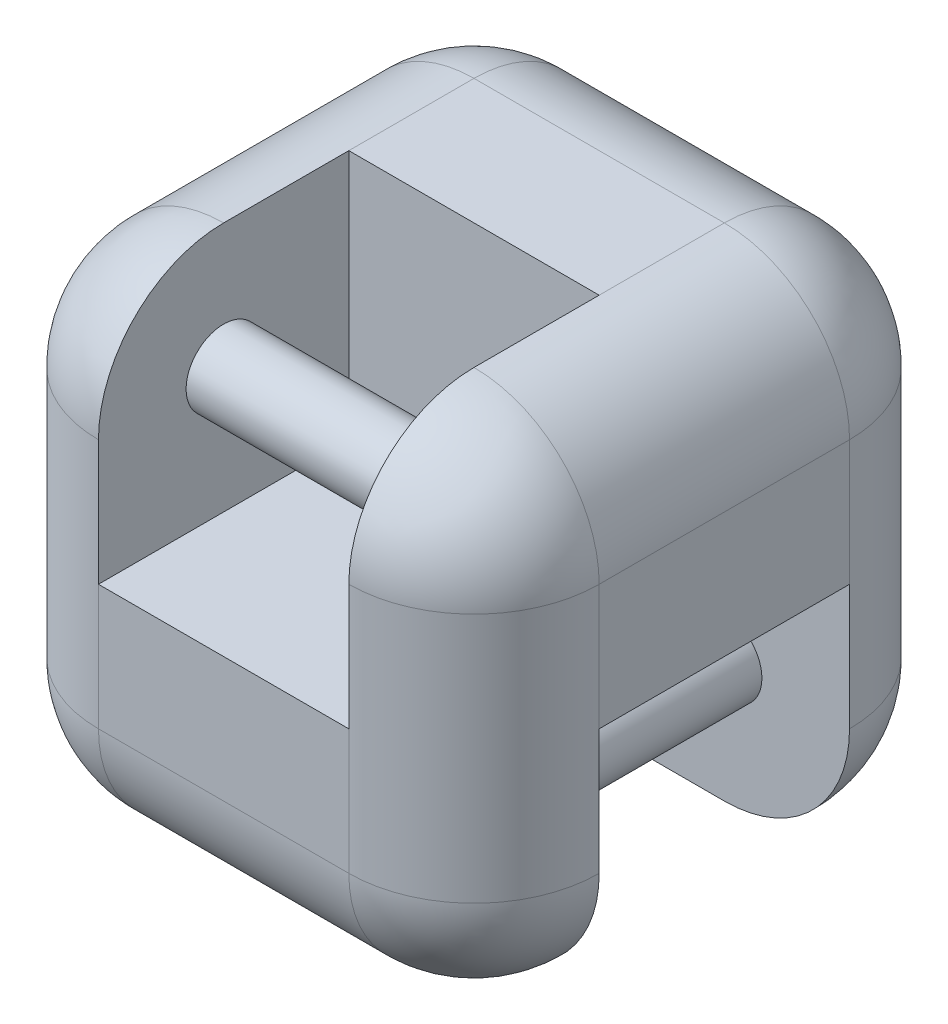
ISO-10303-21;
HEADER;
FILE_DESCRIPTION(('STEP AP214'),'2;1');
FILE_NAME('part.step','',(''),(''),'','','');
FILE_SCHEMA(('AUTOMOTIVE_DESIGN { 1 0 10303 214 1 1 1 1 }'));
ENDSEC;
DATA;
#1=APPLICATION_CONTEXT('core data for automotive mechanical design processes');
#2=APPLICATION_PROTOCOL_DEFINITION('international standard','automotive_design',2000,#1);
#3=PRODUCT_CONTEXT('',#1,'mechanical');
#4=PRODUCT('Part','Part','',(#3));
#5=PRODUCT_RELATED_PRODUCT_CATEGORY('part','',(#4));
#6=PRODUCT_DEFINITION_FORMATION('','',#4);
#7=PRODUCT_DEFINITION_CONTEXT('part definition',#1,'design');
#8=PRODUCT_DEFINITION('design','',#6,#7);
#9=PRODUCT_DEFINITION_SHAPE('','',#8);
#10=(LENGTH_UNIT() NAMED_UNIT(*) SI_UNIT(.MILLI.,.METRE.));
#11=(NAMED_UNIT(*) PLANE_ANGLE_UNIT() SI_UNIT($,.RADIAN.));
#12=(NAMED_UNIT(*) SI_UNIT($,.STERADIAN.) SOLID_ANGLE_UNIT());
#13=UNCERTAINTY_MEASURE_WITH_UNIT(LENGTH_MEASURE(1.E-05),#10,'distance_accuracy_value','');
#14=(GEOMETRIC_REPRESENTATION_CONTEXT(3) GLOBAL_UNCERTAINTY_ASSIGNED_CONTEXT((#13)) GLOBAL_UNIT_ASSIGNED_CONTEXT((#10,
#11,#12)) REPRESENTATION_CONTEXT('',''));
#15=CARTESIAN_POINT('',(0.,0.,0.));
#16=DIRECTION('',(0.,0.,1.));
#17=DIRECTION('',(1.,0.,0.));
#18=AXIS2_PLACEMENT_3D('',#15,#16,#17);
#19=CARTESIAN_POINT('',(-8.40814268768748,22.1655598813284,15.));
#20=DIRECTION('',(0.,0.,-1.));
#21=DIRECTION('',(-1.,0.,0.));
#22=AXIS2_PLACEMENT_3D('',#19,#20,#21);
#23=CYLINDRICAL_SURFACE('',#22,1.5);
#24=CARTESIAN_POINT('',(-8.40814268768748,22.1655598813284,15.));
#25=DIRECTION('',(0.,0.,1.));
#26=DIRECTION('',(1.,0.,0.));
#27=AXIS2_PLACEMENT_3D('',#24,#25,#26);
#28=CIRCLE('',#27,1.5);
#29=CARTESIAN_POINT('',(-6.90814268768748,22.1655598813284,15.));
#30=VERTEX_POINT('',#29);
#31=EDGE_CURVE('E11',#30,#30,#28,.T.);
#32=ORIENTED_EDGE('',*,*,#31,.F.);
#33=EDGE_LOOP('',(#32));
#34=FACE_BOUND('',#33,.T.);
#35=CARTESIAN_POINT('',(-8.40814268768748,22.1655598813284,5.));
#36=DIRECTION('',(0.,0.,1.));
#37=DIRECTION('',(1.,0.,0.));
#38=AXIS2_PLACEMENT_3D('',#35,#36,#37);
#39=CIRCLE('',#38,1.5);
#40=CARTESIAN_POINT('',(-6.90814268768748,22.1655598813284,5.));
#41=VERTEX_POINT('',#40);
#42=EDGE_CURVE('E46',#41,#41,#39,.T.);
#43=ORIENTED_EDGE('',*,*,#42,.T.);
#44=EDGE_LOOP('',(#43));
#45=FACE_BOUND('',#44,.T.);
#46=ADVANCED_FACE('F43',(#34,#45),#23,.T.);
#47=CARTESIAN_POINT('',(-8.40814268768748,22.1655598813284,15.));
#48=DIRECTION('',(0.,0.,1.));
#49=DIRECTION('',(1.,0.,0.));
#50=AXIS2_PLACEMENT_3D('',#47,#48,#49);
#51=PLANE('',#50);
#52=ORIENTED_EDGE('',*,*,#31,.T.);
#53=EDGE_LOOP('',(#52));
#54=FACE_BOUND('',#53,.T.);
#55=ADVANCED_FACE('F58',(#54),#51,.T.);
#56=CARTESIAN_POINT('',(-8.40814268768748,22.1655598813284,5.));
#57=DIRECTION('',(0.,0.,1.));
#58=DIRECTION('',(1.,0.,0.));
#59=AXIS2_PLACEMENT_3D('',#56,#57,#58);
#60=PLANE('',#59);
#61=ORIENTED_EDGE('',*,*,#42,.F.);
#62=EDGE_LOOP('',(#61));
#63=FACE_BOUND('',#62,.T.);
#64=ADVANCED_FACE('F56',(#63),#60,.F.);
#65=CLOSED_SHELL('',(#46,#55,#64));
#66=MANIFOLD_SOLID_BREP('B2',#65);
#67=CARTESIAN_POINT('',(-18.4081426876875,32.1655598813284,15.));
#68=DIRECTION('',(1.,0.,0.));
#69=DIRECTION('',(0.,0.,-1.));
#70=AXIS2_PLACEMENT_3D('',#67,#68,#69);
#71=CYLINDRICAL_SURFACE('',#70,1.5);
#72=CARTESIAN_POINT('',(-18.4081426876875,32.1655598813284,15.));
#73=DIRECTION('',(-1.,0.,0.));
#74=DIRECTION('',(0.,0.,1.));
#75=AXIS2_PLACEMENT_3D('',#72,#73,#74);
#76=CIRCLE('',#75,1.5);
#77=CARTESIAN_POINT('',(-18.4081426876875,32.1655598813284,16.5));
#78=VERTEX_POINT('',#77);
#79=EDGE_CURVE('E42',#78,#78,#76,.T.);
#80=ORIENTED_EDGE('',*,*,#79,.F.);
#81=EDGE_LOOP('',(#80));
#82=FACE_BOUND('',#81,.T.);
#83=CARTESIAN_POINT('',(-8.40814268768748,32.1655598813284,15.));
#84=DIRECTION('',(-1.,0.,0.));
#85=DIRECTION('',(0.,0.,1.));
#86=AXIS2_PLACEMENT_3D('',#83,#84,#85);
#87=CIRCLE('',#86,1.5);
#88=CARTESIAN_POINT('',(-8.40814268768748,32.1655598813284,16.5));
#89=VERTEX_POINT('',#88);
#90=EDGE_CURVE('E95',#89,#89,#87,.T.);
#91=ORIENTED_EDGE('',*,*,#90,.T.);
#92=EDGE_LOOP('',(#91));
#93=FACE_BOUND('',#92,.T.);
#94=ADVANCED_FACE('F92',(#82,#93),#71,.T.);
#95=CARTESIAN_POINT('',(-18.4081426876875,32.1655598813284,15.));
#96=DIRECTION('',(-1.,0.,0.));
#97=DIRECTION('',(0.,0.,1.));
#98=AXIS2_PLACEMENT_3D('',#95,#96,#97);
#99=PLANE('',#98);
#100=ORIENTED_EDGE('',*,*,#79,.T.);
#101=EDGE_LOOP('',(#100));
#102=FACE_BOUND('',#101,.T.);
#103=ADVANCED_FACE('F107',(#102),#99,.T.);
#104=CARTESIAN_POINT('',(-8.40814268768748,32.1655598813284,15.));
#105=DIRECTION('',(-1.,0.,0.));
#106=DIRECTION('',(0.,0.,1.));
#107=AXIS2_PLACEMENT_3D('',#104,#105,#106);
#108=PLANE('',#107);
#109=ORIENTED_EDGE('',*,*,#90,.F.);
#110=EDGE_LOOP('',(#109));
#111=FACE_BOUND('',#110,.T.);
#112=ADVANCED_FACE('F105',(#111),#108,.F.);
#113=CLOSED_SHELL('',(#94,#103,#112));
#114=MANIFOLD_SOLID_BREP('B6',#113);
#115=CARTESIAN_POINT('',(-23.4081426876875,17.1655598813284,20.));
#116=DIRECTION('',(0.,1.,0.));
#117=DIRECTION('',(0.,0.,1.));
#118=AXIS2_PLACEMENT_3D('',#115,#116,#117);
#119=PLANE('',#118);
#120=DIRECTION('',(0.,0.,-1.));
#121=VECTOR('',#120,1.);
#122=CARTESIAN_POINT('',(-13.4081426876875,17.1655598813284,15.));
#123=LINE('',#122,#121);
#124=CARTESIAN_POINT('',(-13.4081426876875,17.1655598813284,15.));
#125=VERTEX_POINT('',#124);
#126=CARTESIAN_POINT('',(-13.4081426876875,17.1655598813284,5.));
#127=VERTEX_POINT('',#126);
#128=EDGE_CURVE('E149',#125,#127,#123,.T.);
#129=ORIENTED_EDGE('',*,*,#128,.F.);
#130=DIRECTION('',(1.,0.,0.));
#131=VECTOR('',#130,1.);
#132=CARTESIAN_POINT('',(-23.4081426876875,17.1655598813284,15.));
#133=LINE('',#132,#131);
#134=CARTESIAN_POINT('',(-18.4081426876875,17.1655598813284,15.));
#135=VERTEX_POINT('',#134);
#136=EDGE_CURVE('E415',#125,#135,#133,.F.);
#137=ORIENTED_EDGE('',*,*,#136,.T.);
#138=DIRECTION('',(0.,0.,-1.));
#139=VECTOR('',#138,1.);
#140=CARTESIAN_POINT('',(-18.4081426876875,17.1655598813284,20.));
#141=LINE('',#140,#139);
#142=CARTESIAN_POINT('',(-18.4081426876875,17.1655598813284,5.));
#143=VERTEX_POINT('',#142);
#144=EDGE_CURVE('E300',#135,#143,#141,.T.);
#145=ORIENTED_EDGE('',*,*,#144,.T.);
#146=DIRECTION('',(1.,0.,0.));
#147=VECTOR('',#146,1.);
#148=CARTESIAN_POINT('',(-23.4081426876875,17.1655598813284,5.));
#149=LINE('',#148,#147);
#150=EDGE_CURVE('E305',#143,#127,#149,.T.);
#151=ORIENTED_EDGE('',*,*,#150,.T.);
#152=EDGE_LOOP('',(#129,#137,#145,#151));
#153=FACE_BOUND('',#152,.T.);
#154=ADVANCED_FACE('F132',(#153),#119,.F.);
#155=CARTESIAN_POINT('',(-3.40814268768748,37.1655598813284,20.));
#156=DIRECTION('',(-1.,0.,0.));
#157=DIRECTION('',(0.,0.,1.));
#158=AXIS2_PLACEMENT_3D('',#155,#156,#157);
#159=PLANE('',#158);
#160=DIRECTION('',(0.,0.,-1.));
#161=VECTOR('',#160,1.);
#162=CARTESIAN_POINT('',(-3.40814268768748,27.1655598813284,15.));
#163=LINE('',#162,#161);
#164=CARTESIAN_POINT('',(-3.40814268768748,27.1655598813284,15.));
#165=VERTEX_POINT('',#164);
#166=CARTESIAN_POINT('',(-3.40814268768748,27.1655598813284,5.));
#167=VERTEX_POINT('',#166);
#168=EDGE_CURVE('E276',#165,#167,#163,.T.);
#169=ORIENTED_EDGE('',*,*,#168,.T.);
#170=DIRECTION('',(0.,1.,0.));
#171=VECTOR('',#170,1.);
#172=CARTESIAN_POINT('',(-3.40814268768748,37.1655598813284,5.));
#173=LINE('',#172,#171);
#174=CARTESIAN_POINT('',(-3.40814268768748,32.1655598813284,5.));
#175=VERTEX_POINT('',#174);
#176=EDGE_CURVE('E302',#167,#175,#173,.T.);
#177=ORIENTED_EDGE('',*,*,#176,.T.);
#178=DIRECTION('',(0.,0.,-1.));
#179=VECTOR('',#178,1.);
#180=CARTESIAN_POINT('',(-3.40814268768748,32.1655598813284,20.));
#181=LINE('',#180,#179);
#182=CARTESIAN_POINT('',(-3.40814268768748,32.1655598813284,15.));
#183=VERTEX_POINT('',#182);
#184=EDGE_CURVE('E299',#175,#183,#181,.F.);
#185=ORIENTED_EDGE('',*,*,#184,.T.);
#186=DIRECTION('',(0.,1.,0.));
#187=VECTOR('',#186,1.);
#188=CARTESIAN_POINT('',(-3.40814268768748,17.1655598813284,15.));
#189=LINE('',#188,#187);
#190=EDGE_CURVE('E289',#183,#165,#189,.F.);
#191=ORIENTED_EDGE('',*,*,#190,.T.);
#192=EDGE_LOOP('',(#169,#177,#185,#191));
#193=FACE_BOUND('',#192,.T.);
#194=ADVANCED_FACE('F297',(#193),#159,.F.);
#195=CARTESIAN_POINT('',(-18.4081426876875,27.1655598813284,10.));
#196=DIRECTION('',(0.,1.,0.));
#197=DIRECTION('',(0.,0.,1.));
#198=AXIS2_PLACEMENT_3D('',#195,#196,#197);
#199=PLANE('',#198);
#200=DIRECTION('',(-1.,0.,0.));
#201=VECTOR('',#200,1.);
#202=CARTESIAN_POINT('',(-13.4081426876875,27.1655598813284,15.));
#203=LINE('',#202,#201);
#204=CARTESIAN_POINT('',(-8.40814268768748,27.1655598813284,15.));
#205=VERTEX_POINT('',#204);
#206=CARTESIAN_POINT('',(-13.4081426876875,27.1655598813284,15.));
#207=VERTEX_POINT('',#206);
#208=EDGE_CURVE('E270',#205,#207,#203,.T.);
#209=ORIENTED_EDGE('',*,*,#208,.T.);
#210=DIRECTION('',(0.,0.,-1.));
#211=VECTOR('',#210,1.);
#212=CARTESIAN_POINT('',(-13.4081426876875,27.1655598813284,15.));
#213=LINE('',#212,#211);
#214=CARTESIAN_POINT('',(-13.4081426876875,27.1655598813284,10.));
#215=VERTEX_POINT('',#214);
#216=EDGE_CURVE('E284',#207,#215,#213,.T.);
#217=ORIENTED_EDGE('',*,*,#216,.T.);
#218=DIRECTION('',(1.,0.,0.));
#219=VECTOR('',#218,1.);
#220=CARTESIAN_POINT('',(-18.4081426876875,27.1655598813284,10.));
#221=LINE('',#220,#219);
#222=CARTESIAN_POINT('',(-18.4081426876875,27.1655598813284,10.));
#223=VERTEX_POINT('',#222);
#224=EDGE_CURVE('E457',#223,#215,#221,.T.);
#225=ORIENTED_EDGE('',*,*,#224,.F.);
#226=DIRECTION('',(0.,0.,1.));
#227=VECTOR('',#226,1.);
#228=CARTESIAN_POINT('',(-18.4081426876875,27.1655598813284,10.));
#229=LINE('',#228,#227);
#230=CARTESIAN_POINT('',(-18.4081426876875,27.1655598813284,20.));
#231=VERTEX_POINT('',#230);
#232=EDGE_CURVE('E445',#223,#231,#229,.T.);
#233=ORIENTED_EDGE('',*,*,#232,.T.);
#234=DIRECTION('',(1.,0.,0.));
#235=VECTOR('',#234,1.);
#236=CARTESIAN_POINT('',(-18.4081426876875,27.1655598813284,20.));
#237=LINE('',#236,#235);
#238=CARTESIAN_POINT('',(-8.40814268768748,27.1655598813284,20.));
#239=VERTEX_POINT('',#238);
#240=EDGE_CURVE('E448',#231,#239,#237,.T.);
#241=ORIENTED_EDGE('',*,*,#240,.T.);
#242=DIRECTION('',(0.,0.,1.));
#243=VECTOR('',#242,1.);
#244=CARTESIAN_POINT('',(-8.40814268768748,27.1655598813284,10.));
#245=LINE('',#244,#243);
#246=EDGE_CURVE('E453',#205,#239,#245,.T.);
#247=ORIENTED_EDGE('',*,*,#246,.F.);
#248=EDGE_LOOP('',(#209,#217,#225,#233,#241,#247));
#249=FACE_BOUND('',#248,.T.);
#250=ADVANCED_FACE('F504',(#249),#199,.T.);
#251=CARTESIAN_POINT('',(-23.4081426876875,37.1655598813284,20.));
#252=DIRECTION('',(0.,-1.,0.));
#253=DIRECTION('',(0.,0.,-1.));
#254=AXIS2_PLACEMENT_3D('',#251,#252,#253);
#255=PLANE('',#254);
#256=DIRECTION('',(1.,0.,0.));
#257=VECTOR('',#256,1.);
#258=CARTESIAN_POINT('',(-18.4081426876875,37.1655598813284,10.));
#259=LINE('',#258,#257);
#260=CARTESIAN_POINT('',(-18.4081426876875,37.1655598813284,10.));
#261=VERTEX_POINT('',#260);
#262=CARTESIAN_POINT('',(-8.40814268768748,37.1655598813284,10.));
#263=VERTEX_POINT('',#262);
#264=EDGE_CURVE('E329',#261,#263,#259,.T.);
#265=ORIENTED_EDGE('',*,*,#264,.T.);
#266=DIRECTION('',(0.,0.,-1.));
#267=VECTOR('',#266,1.);
#268=CARTESIAN_POINT('',(-8.40814268768748,37.1655598813284,20.));
#269=LINE('',#268,#267);
#270=CARTESIAN_POINT('',(-8.40814268768748,37.1655598813284,5.));
#271=VERTEX_POINT('',#270);
#272=EDGE_CURVE('E311',#263,#271,#269,.T.);
#273=ORIENTED_EDGE('',*,*,#272,.T.);
#274=DIRECTION('',(-1.,0.,0.));
#275=VECTOR('',#274,1.);
#276=CARTESIAN_POINT('',(-23.4081426876875,37.1655598813284,5.));
#277=LINE('',#276,#275);
#278=CARTESIAN_POINT('',(-18.4081426876875,37.1655598813284,5.));
#279=VERTEX_POINT('',#278);
#280=EDGE_CURVE('E318',#271,#279,#277,.T.);
#281=ORIENTED_EDGE('',*,*,#280,.T.);
#282=DIRECTION('',(0.,0.,-1.));
#283=VECTOR('',#282,1.);
#284=CARTESIAN_POINT('',(-18.4081426876875,37.1655598813284,20.));
#285=LINE('',#284,#283);
#286=EDGE_CURVE('E315',#279,#261,#285,.F.);
#287=ORIENTED_EDGE('',*,*,#286,.T.);
#288=EDGE_LOOP('',(#265,#273,#281,#287));
#289=FACE_BOUND('',#288,.T.);
#290=ADVANCED_FACE('F465',(#289),#255,.F.);
#291=CARTESIAN_POINT('',(0.,0.,20.));
#292=DIRECTION('',(0.,0.,1.));
#293=DIRECTION('',(1.,0.,0.));
#294=AXIS2_PLACEMENT_3D('',#291,#292,#293);
#295=PLANE('',#294);
#296=DIRECTION('',(0.,1.,0.));
#297=VECTOR('',#296,1.);
#298=CARTESIAN_POINT('',(-8.40814268768748,37.1655598813284,20.));
#299=LINE('',#298,#297);
#300=CARTESIAN_POINT('',(-8.40814268768748,22.1655598813284,20.));
#301=VERTEX_POINT('',#300);
#302=EDGE_CURVE('E323',#301,#239,#299,.T.);
#303=ORIENTED_EDGE('',*,*,#302,.T.);
#304=ORIENTED_EDGE('',*,*,#240,.F.);
#305=DIRECTION('',(0.,-1.,0.));
#306=VECTOR('',#305,1.);
#307=CARTESIAN_POINT('',(-18.4081426876875,17.1655598813284,20.));
#308=LINE('',#307,#306);
#309=CARTESIAN_POINT('',(-18.4081426876875,22.1655598813284,20.));
#310=VERTEX_POINT('',#309);
#311=EDGE_CURVE('E141',#231,#310,#308,.T.);
#312=ORIENTED_EDGE('',*,*,#311,.T.);
#313=DIRECTION('',(1.,0.,0.));
#314=VECTOR('',#313,1.);
#315=CARTESIAN_POINT('',(-3.40814268768748,22.1655598813284,20.));
#316=LINE('',#315,#314);
#317=EDGE_CURVE('E321',#310,#301,#316,.T.);
#318=ORIENTED_EDGE('',*,*,#317,.T.);
#319=EDGE_LOOP('',(#303,#304,#312,#318));
#320=FACE_BOUND('',#319,.T.);
#321=ADVANCED_FACE('F501',(#320),#295,.T.);
#322=CARTESIAN_POINT('',(-23.4081426876875,37.1655598813284,20.));
#323=DIRECTION('',(1.,0.,0.));
#324=DIRECTION('',(0.,0.,-1.));
#325=AXIS2_PLACEMENT_3D('',#322,#323,#324);
#326=PLANE('',#325);
#327=DIRECTION('',(0.,0.,-1.));
#328=VECTOR('',#327,1.);
#329=CARTESIAN_POINT('',(-23.4081426876875,32.1655598813284,20.));
#330=LINE('',#329,#328);
#331=CARTESIAN_POINT('',(-23.4081426876875,32.1655598813284,15.));
#332=VERTEX_POINT('',#331);
#333=CARTESIAN_POINT('',(-23.4081426876875,32.1655598813284,5.));
#334=VERTEX_POINT('',#333);
#335=EDGE_CURVE('E392',#332,#334,#330,.T.);
#336=ORIENTED_EDGE('',*,*,#335,.T.);
#337=DIRECTION('',(0.,-1.,0.));
#338=VECTOR('',#337,1.);
#339=CARTESIAN_POINT('',(-23.4081426876875,37.1655598813284,5.));
#340=LINE('',#339,#338);
#341=CARTESIAN_POINT('',(-23.4081426876875,22.1655598813284,5.));
#342=VERTEX_POINT('',#341);
#343=EDGE_CURVE('E403',#334,#342,#340,.T.);
#344=ORIENTED_EDGE('',*,*,#343,.T.);
#345=DIRECTION('',(0.,0.,-1.));
#346=VECTOR('',#345,1.);
#347=CARTESIAN_POINT('',(-23.4081426876875,22.1655598813284,20.));
#348=LINE('',#347,#346);
#349=CARTESIAN_POINT('',(-23.4081426876875,22.1655598813284,15.));
#350=VERTEX_POINT('',#349);
#351=EDGE_CURVE('E397',#342,#350,#348,.F.);
#352=ORIENTED_EDGE('',*,*,#351,.T.);
#353=DIRECTION('',(0.,-1.,0.));
#354=VECTOR('',#353,1.);
#355=CARTESIAN_POINT('',(-23.4081426876875,37.1655598813284,15.));
#356=LINE('',#355,#354);
#357=EDGE_CURVE('E388',#350,#332,#356,.F.);
#358=ORIENTED_EDGE('',*,*,#357,.T.);
#359=EDGE_LOOP('',(#336,#344,#352,#358));
#360=FACE_BOUND('',#359,.T.);
#361=ADVANCED_FACE('F530',(#360),#326,.F.);
#362=CARTESIAN_POINT('',(0.,0.,0.));
#363=DIRECTION('',(0.,0.,1.));
#364=DIRECTION('',(1.,0.,0.));
#365=AXIS2_PLACEMENT_3D('',#362,#363,#364);
#366=PLANE('',#365);
#367=DIRECTION('',(1.,0.,0.));
#368=VECTOR('',#367,1.);
#369=CARTESIAN_POINT('',(0.,22.1655598813284,0.));
#370=LINE('',#369,#368);
#371=CARTESIAN_POINT('',(-8.40814268768748,22.1655598813284,0.));
#372=VERTEX_POINT('',#371);
#373=CARTESIAN_POINT('',(-18.4081426876875,22.1655598813284,0.));
#374=VERTEX_POINT('',#373);
#375=EDGE_CURVE('E410',#372,#374,#370,.F.);
#376=ORIENTED_EDGE('',*,*,#375,.T.);
#377=DIRECTION('',(0.,-1.,0.));
#378=VECTOR('',#377,1.);
#379=CARTESIAN_POINT('',(-18.4081426876875,0.,0.));
#380=LINE('',#379,#378);
#381=CARTESIAN_POINT('',(-18.4081426876875,32.1655598813284,0.));
#382=VERTEX_POINT('',#381);
#383=EDGE_CURVE('E412',#374,#382,#380,.F.);
#384=ORIENTED_EDGE('',*,*,#383,.T.);
#385=DIRECTION('',(-1.,0.,0.));
#386=VECTOR('',#385,1.);
#387=CARTESIAN_POINT('',(0.,32.1655598813284,0.));
#388=LINE('',#387,#386);
#389=CARTESIAN_POINT('',(-8.40814268768748,32.1655598813284,0.));
#390=VERTEX_POINT('',#389);
#391=EDGE_CURVE('E406',#382,#390,#388,.F.);
#392=ORIENTED_EDGE('',*,*,#391,.T.);
#393=DIRECTION('',(0.,1.,0.));
#394=VECTOR('',#393,1.);
#395=CARTESIAN_POINT('',(-8.40814268768748,0.,0.));
#396=LINE('',#395,#394);
#397=EDGE_CURVE('E408',#390,#372,#396,.F.);
#398=ORIENTED_EDGE('',*,*,#397,.T.);
#399=EDGE_LOOP('',(#376,#384,#392,#398));
#400=FACE_BOUND('',#399,.T.);
#401=ADVANCED_FACE('F532',(#400),#366,.F.);
#402=CARTESIAN_POINT('',(-8.40814268768748,0.,15.));
#403=DIRECTION('',(0.,-1.,0.));
#404=DIRECTION('',(0.,0.,-1.));
#405=AXIS2_PLACEMENT_3D('',#402,#403,#404);
#406=CYLINDRICAL_SURFACE('',#405,5.);
#407=CARTESIAN_POINT('',(-8.40814268768748,32.1655598813284,15.));
#408=DIRECTION('',(0.,1.,0.));
#409=DIRECTION('',(0.,0.,1.));
#410=AXIS2_PLACEMENT_3D('',#407,#408,#409);
#411=CIRCLE('',#410,5.);
#412=CARTESIAN_POINT('',(-8.40814268768748,32.1655598813284,20.));
#413=VERTEX_POINT('',#412);
#414=EDGE_CURVE('E136',#413,#183,#411,.T.);
#415=ORIENTED_EDGE('',*,*,#414,.F.);
#416=DIRECTION('',(0.,1.,0.));
#417=VECTOR('',#416,1.);
#418=CARTESIAN_POINT('',(-8.40814268768748,27.1655598813284,20.));
#419=LINE('',#418,#417);
#420=EDGE_CURVE('E442',#239,#413,#419,.T.);
#421=ORIENTED_EDGE('',*,*,#420,.F.);
#422=ORIENTED_EDGE('',*,*,#302,.F.);
#423=CARTESIAN_POINT('',(-8.40814268768748,22.1655598813284,15.));
#424=DIRECTION('',(0.,-1.,0.));
#425=DIRECTION('',(0.,0.,-1.));
#426=AXIS2_PLACEMENT_3D('',#423,#424,#425);
#427=CIRCLE('',#426,5.);
#428=CARTESIAN_POINT('',(-3.40814268768748,22.1655598813284,15.));
#429=VERTEX_POINT('',#428);
#430=EDGE_CURVE('E293',#429,#301,#427,.T.);
#431=ORIENTED_EDGE('',*,*,#430,.F.);
#432=DIRECTION('',(0.,1.,0.));
#433=VECTOR('',#432,1.);
#434=CARTESIAN_POINT('',(-3.40814268768748,27.1655598813284,15.));
#435=LINE('',#434,#433);
#436=EDGE_CURVE('E266',#429,#165,#435,.T.);
#437=ORIENTED_EDGE('',*,*,#436,.T.);
#438=ORIENTED_EDGE('',*,*,#190,.F.);
#439=EDGE_LOOP('',(#415,#421,#422,#431,#437,#438));
#440=FACE_BOUND('',#439,.T.);
#441=ADVANCED_FACE('F134',(#440),#406,.T.);
#442=CARTESIAN_POINT('',(-8.40814268768748,32.1655598813284,15.));
#443=DIRECTION('',(0.,0.,1.));
#444=DIRECTION('',(1.,0.,0.));
#445=AXIS2_PLACEMENT_3D('',#442,#443,#444);
#446=SPHERICAL_SURFACE('',#445,5.);
#447=CARTESIAN_POINT('',(-8.40814268768748,32.1655598813284,15.));
#448=DIRECTION('',(1.,0.,0.));
#449=DIRECTION('',(0.,0.,-1.));
#450=AXIS2_PLACEMENT_3D('',#447,#448,#449);
#451=CIRCLE('',#450,5.);
#452=CARTESIAN_POINT('',(-8.40814268768748,37.1655598813284,15.));
#453=VERTEX_POINT('',#452);
#454=EDGE_CURVE('E382',#413,#453,#451,.F.);
#455=ORIENTED_EDGE('',*,*,#454,.F.);
#456=ORIENTED_EDGE('',*,*,#414,.T.);
#457=CARTESIAN_POINT('',(-8.40814268768748,32.1655598813284,15.));
#458=DIRECTION('',(0.,0.,1.));
#459=DIRECTION('',(1.,0.,0.));
#460=AXIS2_PLACEMENT_3D('',#457,#458,#459);
#461=CIRCLE('',#460,5.);
#462=EDGE_CURVE('E384',#453,#183,#461,.F.);
#463=ORIENTED_EDGE('',*,*,#462,.F.);
#464=EDGE_LOOP('',(#455,#456,#463));
#465=FACE_BOUND('',#464,.T.);
#466=ADVANCED_FACE('F576',(#465),#446,.T.);
#467=CARTESIAN_POINT('',(-8.40814268768748,22.1655598813284,15.));
#468=DIRECTION('',(0.,0.,1.));
#469=DIRECTION('',(1.,0.,0.));
#470=AXIS2_PLACEMENT_3D('',#467,#468,#469);
#471=SPHERICAL_SURFACE('',#470,5.);
#472=CARTESIAN_POINT('',(-8.40814268768748,22.1655598813284,15.));
#473=DIRECTION('',(0.,0.,1.));
#474=DIRECTION('',(1.,0.,0.));
#475=AXIS2_PLACEMENT_3D('',#472,#473,#474);
#476=CIRCLE('',#475,5.);
#477=CARTESIAN_POINT('',(-8.40814268768748,17.1655598813284,15.));
#478=VERTEX_POINT('',#477);
#479=EDGE_CURVE('E377',#429,#478,#476,.F.);
#480=ORIENTED_EDGE('',*,*,#479,.F.);
#481=ORIENTED_EDGE('',*,*,#430,.T.);
#482=CARTESIAN_POINT('',(-8.40814268768748,22.1655598813284,15.));
#483=DIRECTION('',(1.,0.,0.));
#484=DIRECTION('',(0.,0.,-1.));
#485=AXIS2_PLACEMENT_3D('',#482,#483,#484);
#486=CIRCLE('',#485,5.);
#487=EDGE_CURVE('E379',#478,#301,#486,.F.);
#488=ORIENTED_EDGE('',*,*,#487,.F.);
#489=EDGE_LOOP('',(#480,#481,#488));
#490=FACE_BOUND('',#489,.T.);
#491=ADVANCED_FACE('F574',(#490),#471,.T.);
#492=CARTESIAN_POINT('',(-8.40814268768748,32.1655598813284,20.));
#493=DIRECTION('',(0.,0.,-1.));
#494=DIRECTION('',(-1.,0.,0.));
#495=AXIS2_PLACEMENT_3D('',#492,#493,#494);
#496=CYLINDRICAL_SURFACE('',#495,5.);
#497=ORIENTED_EDGE('',*,*,#462,.T.);
#498=ORIENTED_EDGE('',*,*,#184,.F.);
#499=CARTESIAN_POINT('',(-8.40814268768748,32.1655598813284,5.));
#500=DIRECTION('',(0.,0.,-1.));
#501=DIRECTION('',(-1.,0.,0.));
#502=AXIS2_PLACEMENT_3D('',#499,#500,#501);
#503=CIRCLE('',#502,5.);
#504=EDGE_CURVE('E371',#271,#175,#503,.T.);
#505=ORIENTED_EDGE('',*,*,#504,.F.);
#506=ORIENTED_EDGE('',*,*,#272,.F.);
#507=EDGE_CURVE('E312',#453,#263,#269,.T.);
#508=ORIENTED_EDGE('',*,*,#507,.F.);
#509=EDGE_LOOP('',(#497,#498,#505,#506,#508));
#510=FACE_BOUND('',#509,.T.);
#511=ADVANCED_FACE('F472',(#510),#496,.T.);
#512=CARTESIAN_POINT('',(-18.4081426876875,0.,15.));
#513=DIRECTION('',(0.,1.,0.));
#514=DIRECTION('',(0.,0.,1.));
#515=AXIS2_PLACEMENT_3D('',#512,#513,#514);
#516=CYLINDRICAL_SURFACE('',#515,5.);
#517=CARTESIAN_POINT('',(-18.4081426876875,22.1655598813284,15.));
#518=DIRECTION('',(0.,-1.,0.));
#519=DIRECTION('',(0.,0.,-1.));
#520=AXIS2_PLACEMENT_3D('',#517,#518,#519);
#521=CIRCLE('',#520,5.);
#522=EDGE_CURVE('E362',#310,#350,#521,.T.);
#523=ORIENTED_EDGE('',*,*,#522,.F.);
#524=ORIENTED_EDGE('',*,*,#311,.F.);
#525=CARTESIAN_POINT('',(-18.4081426876875,32.1655598813284,20.));
#526=VERTEX_POINT('',#525);
#527=EDGE_CURVE('E90',#526,#231,#308,.T.);
#528=ORIENTED_EDGE('',*,*,#527,.F.);
#529=CARTESIAN_POINT('',(-18.4081426876875,32.1655598813284,15.));
#530=DIRECTION('',(0.,1.,0.));
#531=DIRECTION('',(0.,0.,1.));
#532=AXIS2_PLACEMENT_3D('',#529,#530,#531);
#533=CIRCLE('',#532,5.);
#534=EDGE_CURVE('E365',#332,#526,#533,.T.);
#535=ORIENTED_EDGE('',*,*,#534,.F.);
#536=ORIENTED_EDGE('',*,*,#357,.F.);
#537=EDGE_LOOP('',(#523,#524,#528,#535,#536));
#538=FACE_BOUND('',#537,.T.);
#539=ADVANCED_FACE('F497',(#538),#516,.T.);
#540=CARTESIAN_POINT('',(0.,22.1655598813284,15.));
#541=DIRECTION('',(-1.,0.,0.));
#542=DIRECTION('',(0.,0.,1.));
#543=AXIS2_PLACEMENT_3D('',#540,#541,#542);
#544=CYLINDRICAL_SURFACE('',#543,5.);
#545=ORIENTED_EDGE('',*,*,#487,.T.);
#546=ORIENTED_EDGE('',*,*,#317,.F.);
#547=CARTESIAN_POINT('',(-18.4081426876875,22.1655598813284,15.));
#548=DIRECTION('',(-1.,0.,0.));
#549=DIRECTION('',(0.,0.,1.));
#550=AXIS2_PLACEMENT_3D('',#547,#548,#549);
#551=CIRCLE('',#550,5.);
#552=EDGE_CURVE('E359',#135,#310,#551,.T.);
#553=ORIENTED_EDGE('',*,*,#552,.F.);
#554=ORIENTED_EDGE('',*,*,#136,.F.);
#555=EDGE_CURVE('E416',#478,#125,#133,.F.);
#556=ORIENTED_EDGE('',*,*,#555,.F.);
#557=EDGE_LOOP('',(#545,#546,#553,#554,#556));
#558=FACE_BOUND('',#557,.T.);
#559=ADVANCED_FACE('F565',(#558),#544,.T.);
#560=CARTESIAN_POINT('',(-8.40814268768748,37.1655598813284,5.));
#561=DIRECTION('',(0.,1.,0.));
#562=DIRECTION('',(0.,0.,1.));
#563=AXIS2_PLACEMENT_3D('',#560,#561,#562);
#564=CYLINDRICAL_SURFACE('',#563,5.);
#565=CARTESIAN_POINT('',(-8.40814268768748,32.1655598813284,5.));
#566=DIRECTION('',(0.,1.,0.));
#567=DIRECTION('',(0.,0.,1.));
#568=AXIS2_PLACEMENT_3D('',#565,#566,#567);
#569=CIRCLE('',#568,5.);
#570=EDGE_CURVE('E374',#175,#390,#569,.T.);
#571=ORIENTED_EDGE('',*,*,#570,.F.);
#572=ORIENTED_EDGE('',*,*,#176,.F.);
#573=CARTESIAN_POINT('',(-3.40814268768748,22.1655598813284,5.));
#574=VERTEX_POINT('',#573);
#575=EDGE_CURVE('E309',#574,#167,#173,.T.);
#576=ORIENTED_EDGE('',*,*,#575,.F.);
#577=CARTESIAN_POINT('',(-8.40814268768748,22.1655598813284,5.));
#578=DIRECTION('',(0.,-1.,0.));
#579=DIRECTION('',(0.,0.,-1.));
#580=AXIS2_PLACEMENT_3D('',#577,#578,#579);
#581=CIRCLE('',#580,5.);
#582=EDGE_CURVE('E353',#372,#574,#581,.T.);
#583=ORIENTED_EDGE('',*,*,#582,.F.);
#584=ORIENTED_EDGE('',*,*,#397,.F.);
#585=EDGE_LOOP('',(#571,#572,#576,#583,#584));
#586=FACE_BOUND('',#585,.T.);
#587=ADVANCED_FACE('F562',(#586),#564,.T.);
#588=CARTESIAN_POINT('',(-8.40814268768748,32.1655598813284,5.));
#589=DIRECTION('',(0.,0.,1.));
#590=DIRECTION('',(1.,0.,0.));
#591=AXIS2_PLACEMENT_3D('',#588,#589,#590);
#592=SPHERICAL_SURFACE('',#591,5.);
#593=ORIENTED_EDGE('',*,*,#504,.T.);
#594=ORIENTED_EDGE('',*,*,#570,.T.);
#595=CARTESIAN_POINT('',(-8.40814268768748,32.1655598813284,5.));
#596=DIRECTION('',(1.,0.,0.));
#597=DIRECTION('',(0.,0.,-1.));
#598=AXIS2_PLACEMENT_3D('',#595,#596,#597);
#599=CIRCLE('',#598,5.);
#600=EDGE_CURVE('E350',#271,#390,#599,.F.);
#601=ORIENTED_EDGE('',*,*,#600,.F.);
#602=EDGE_LOOP('',(#593,#594,#601));
#603=FACE_BOUND('',#602,.T.);
#604=ADVANCED_FACE('F477',(#603),#592,.T.);
#605=CARTESIAN_POINT('',(-18.4081426876875,32.1655598813284,15.));
#606=DIRECTION('',(0.,0.,1.));
#607=DIRECTION('',(1.,0.,0.));
#608=AXIS2_PLACEMENT_3D('',#605,#606,#607);
#609=SPHERICAL_SURFACE('',#608,5.);
#610=ORIENTED_EDGE('',*,*,#534,.T.);
#611=CARTESIAN_POINT('',(-18.4081426876875,32.1655598813284,15.));
#612=DIRECTION('',(-1.,0.,0.));
#613=DIRECTION('',(0.,0.,1.));
#614=AXIS2_PLACEMENT_3D('',#611,#612,#613);
#615=CIRCLE('',#614,5.);
#616=CARTESIAN_POINT('',(-18.4081426876875,37.1655598813284,15.));
#617=VERTEX_POINT('',#616);
#618=EDGE_CURVE('E368',#526,#617,#615,.T.);
#619=ORIENTED_EDGE('',*,*,#618,.T.);
#620=CARTESIAN_POINT('',(-18.4081426876875,32.1655598813284,15.));
#621=DIRECTION('',(0.,0.,1.));
#622=DIRECTION('',(1.,0.,0.));
#623=AXIS2_PLACEMENT_3D('',#620,#621,#622);
#624=CIRCLE('',#623,5.);
#625=EDGE_CURVE('E347',#332,#617,#624,.F.);
#626=ORIENTED_EDGE('',*,*,#625,.F.);
#627=EDGE_LOOP('',(#610,#619,#626));
#628=FACE_BOUND('',#627,.T.);
#629=ADVANCED_FACE('F494',(#628),#609,.T.);
#630=CARTESIAN_POINT('',(-18.4081426876875,22.1655598813284,15.));
#631=DIRECTION('',(0.,0.,1.));
#632=DIRECTION('',(1.,0.,0.));
#633=AXIS2_PLACEMENT_3D('',#630,#631,#632);
#634=SPHERICAL_SURFACE('',#633,5.);
#635=ORIENTED_EDGE('',*,*,#552,.T.);
#636=ORIENTED_EDGE('',*,*,#522,.T.);
#637=CARTESIAN_POINT('',(-18.4081426876875,22.1655598813284,15.));
#638=DIRECTION('',(0.,0.,1.));
#639=DIRECTION('',(1.,0.,0.));
#640=AXIS2_PLACEMENT_3D('',#637,#638,#639);
#641=CIRCLE('',#640,5.);
#642=EDGE_CURVE('E344',#135,#350,#641,.F.);
#643=ORIENTED_EDGE('',*,*,#642,.F.);
#644=EDGE_LOOP('',(#635,#636,#643));
#645=FACE_BOUND('',#644,.T.);
#646=ADVANCED_FACE('F553',(#645),#634,.T.);
#647=CARTESIAN_POINT('',(-8.40814268768748,22.1655598813284,5.));
#648=DIRECTION('',(0.,0.,1.));
#649=DIRECTION('',(1.,0.,0.));
#650=AXIS2_PLACEMENT_3D('',#647,#648,#649);
#651=SPHERICAL_SURFACE('',#650,5.);
#652=ORIENTED_EDGE('',*,*,#582,.T.);
#653=CARTESIAN_POINT('',(-8.40814268768748,22.1655598813284,5.));
#654=DIRECTION('',(0.,0.,-1.));
#655=DIRECTION('',(-1.,0.,0.));
#656=AXIS2_PLACEMENT_3D('',#653,#654,#655);
#657=CIRCLE('',#656,5.);
#658=CARTESIAN_POINT('',(-8.40814268768748,17.1655598813284,5.));
#659=VERTEX_POINT('',#658);
#660=EDGE_CURVE('E356',#574,#659,#657,.T.);
#661=ORIENTED_EDGE('',*,*,#660,.T.);
#662=CARTESIAN_POINT('',(-8.40814268768748,22.1655598813284,5.));
#663=DIRECTION('',(1.,0.,0.));
#664=DIRECTION('',(0.,0.,-1.));
#665=AXIS2_PLACEMENT_3D('',#662,#663,#664);
#666=CIRCLE('',#665,5.);
#667=EDGE_CURVE('E341',#372,#659,#666,.F.);
#668=ORIENTED_EDGE('',*,*,#667,.F.);
#669=EDGE_LOOP('',(#652,#661,#668));
#670=FACE_BOUND('',#669,.T.);
#671=ADVANCED_FACE('F550',(#670),#651,.T.);
#672=CARTESIAN_POINT('',(-23.4081426876875,32.1655598813284,5.));
#673=DIRECTION('',(-1.,0.,0.));
#674=DIRECTION('',(0.,0.,1.));
#675=AXIS2_PLACEMENT_3D('',#672,#673,#674);
#676=CYLINDRICAL_SURFACE('',#675,5.);
#677=ORIENTED_EDGE('',*,*,#600,.T.);
#678=ORIENTED_EDGE('',*,*,#391,.F.);
#679=CARTESIAN_POINT('',(-18.4081426876875,32.1655598813284,5.));
#680=DIRECTION('',(-1.,0.,0.));
#681=DIRECTION('',(0.,0.,1.));
#682=AXIS2_PLACEMENT_3D('',#679,#680,#681);
#683=CIRCLE('',#682,5.);
#684=EDGE_CURVE('E338',#279,#382,#683,.T.);
#685=ORIENTED_EDGE('',*,*,#684,.F.);
#686=ORIENTED_EDGE('',*,*,#280,.F.);
#687=EDGE_LOOP('',(#677,#678,#685,#686));
#688=FACE_BOUND('',#687,.T.);
#689=ADVANCED_FACE('F481',(#688),#676,.T.);
#690=CARTESIAN_POINT('',(-18.4081426876875,32.1655598813284,20.));
#691=DIRECTION('',(0.,0.,-1.));
#692=DIRECTION('',(-1.,0.,0.));
#693=AXIS2_PLACEMENT_3D('',#690,#691,#692);
#694=CYLINDRICAL_SURFACE('',#693,5.);
#695=ORIENTED_EDGE('',*,*,#625,.T.);
#696=EDGE_CURVE('E314',#261,#617,#285,.F.);
#697=ORIENTED_EDGE('',*,*,#696,.F.);
#698=ORIENTED_EDGE('',*,*,#286,.F.);
#699=CARTESIAN_POINT('',(-18.4081426876875,32.1655598813284,5.));
#700=DIRECTION('',(0.,0.,-1.));
#701=DIRECTION('',(-1.,0.,0.));
#702=AXIS2_PLACEMENT_3D('',#699,#700,#701);
#703=CIRCLE('',#702,5.);
#704=EDGE_CURVE('E336',#334,#279,#703,.T.);
#705=ORIENTED_EDGE('',*,*,#704,.F.);
#706=ORIENTED_EDGE('',*,*,#335,.F.);
#707=EDGE_LOOP('',(#695,#697,#698,#705,#706));
#708=FACE_BOUND('',#707,.T.);
#709=ADVANCED_FACE('F486',(#708),#694,.T.);
#710=CARTESIAN_POINT('',(-18.4081426876875,22.1655598813284,20.));
#711=DIRECTION('',(0.,0.,-1.));
#712=DIRECTION('',(-1.,0.,0.));
#713=AXIS2_PLACEMENT_3D('',#710,#711,#712);
#714=CYLINDRICAL_SURFACE('',#713,5.);
#715=ORIENTED_EDGE('',*,*,#642,.T.);
#716=ORIENTED_EDGE('',*,*,#351,.F.);
#717=CARTESIAN_POINT('',(-18.4081426876875,22.1655598813284,5.));
#718=DIRECTION('',(0.,0.,-1.));
#719=DIRECTION('',(-1.,0.,0.));
#720=AXIS2_PLACEMENT_3D('',#717,#718,#719);
#721=CIRCLE('',#720,5.);
#722=EDGE_CURVE('E333',#143,#342,#721,.T.);
#723=ORIENTED_EDGE('',*,*,#722,.F.);
#724=ORIENTED_EDGE('',*,*,#144,.F.);
#725=EDGE_LOOP('',(#715,#716,#723,#724));
#726=FACE_BOUND('',#725,.T.);
#727=ADVANCED_FACE('F542',(#726),#714,.T.);
#728=CARTESIAN_POINT('',(-23.4081426876875,22.1655598813284,5.));
#729=DIRECTION('',(1.,0.,0.));
#730=DIRECTION('',(0.,0.,-1.));
#731=AXIS2_PLACEMENT_3D('',#728,#729,#730);
#732=CYLINDRICAL_SURFACE('',#731,5.);
#733=ORIENTED_EDGE('',*,*,#667,.T.);
#734=DIRECTION('',(1.,0.,0.));
#735=VECTOR('',#734,1.);
#736=CARTESIAN_POINT('',(-13.4081426876875,17.1655598813284,5.));
#737=LINE('',#736,#735);
#738=EDGE_CURVE('E295',#127,#659,#737,.T.);
#739=ORIENTED_EDGE('',*,*,#738,.F.);
#740=ORIENTED_EDGE('',*,*,#150,.F.);
#741=CARTESIAN_POINT('',(-18.4081426876875,22.1655598813284,5.));
#742=DIRECTION('',(-1.,0.,0.));
#743=DIRECTION('',(0.,0.,1.));
#744=AXIS2_PLACEMENT_3D('',#741,#742,#743);
#745=CIRCLE('',#744,5.);
#746=EDGE_CURVE('E331',#374,#143,#745,.T.);
#747=ORIENTED_EDGE('',*,*,#746,.F.);
#748=ORIENTED_EDGE('',*,*,#375,.F.);
#749=EDGE_LOOP('',(#733,#739,#740,#747,#748));
#750=FACE_BOUND('',#749,.T.);
#751=ADVANCED_FACE('F426',(#750),#732,.T.);
#752=CARTESIAN_POINT('',(-18.4081426876875,32.1655598813284,5.));
#753=DIRECTION('',(0.,0.,1.));
#754=DIRECTION('',(1.,0.,0.));
#755=AXIS2_PLACEMENT_3D('',#752,#753,#754);
#756=SPHERICAL_SURFACE('',#755,5.);
#757=ORIENTED_EDGE('',*,*,#704,.T.);
#758=ORIENTED_EDGE('',*,*,#684,.T.);
#759=CARTESIAN_POINT('',(-18.4081426876875,32.1655598813284,5.));
#760=DIRECTION('',(0.,1.,0.));
#761=DIRECTION('',(0.,0.,1.));
#762=AXIS2_PLACEMENT_3D('',#759,#760,#761);
#763=CIRCLE('',#762,5.);
#764=EDGE_CURVE('E328',#334,#382,#763,.F.);
#765=ORIENTED_EDGE('',*,*,#764,.F.);
#766=EDGE_LOOP('',(#757,#758,#765));
#767=FACE_BOUND('',#766,.T.);
#768=ADVANCED_FACE('F536',(#767),#756,.T.);
#769=CARTESIAN_POINT('',(-18.4081426876875,22.1655598813284,5.));
#770=DIRECTION('',(0.,0.,1.));
#771=DIRECTION('',(1.,0.,0.));
#772=AXIS2_PLACEMENT_3D('',#769,#770,#771);
#773=SPHERICAL_SURFACE('',#772,5.);
#774=ORIENTED_EDGE('',*,*,#746,.T.);
#775=ORIENTED_EDGE('',*,*,#722,.T.);
#776=CARTESIAN_POINT('',(-18.4081426876875,22.1655598813284,5.));
#777=DIRECTION('',(0.,-1.,0.));
#778=DIRECTION('',(0.,0.,-1.));
#779=AXIS2_PLACEMENT_3D('',#776,#777,#778);
#780=CIRCLE('',#779,5.);
#781=EDGE_CURVE('E326',#374,#342,#780,.F.);
#782=ORIENTED_EDGE('',*,*,#781,.F.);
#783=EDGE_LOOP('',(#774,#775,#782));
#784=FACE_BOUND('',#783,.T.);
#785=ADVANCED_FACE('F517',(#784),#773,.T.);
#786=CARTESIAN_POINT('',(-18.4081426876875,37.1655598813284,5.));
#787=DIRECTION('',(0.,-1.,0.));
#788=DIRECTION('',(0.,0.,-1.));
#789=AXIS2_PLACEMENT_3D('',#786,#787,#788);
#790=CYLINDRICAL_SURFACE('',#789,5.);
#791=ORIENTED_EDGE('',*,*,#764,.T.);
#792=ORIENTED_EDGE('',*,*,#383,.F.);
#793=ORIENTED_EDGE('',*,*,#781,.T.);
#794=ORIENTED_EDGE('',*,*,#343,.F.);
#795=EDGE_LOOP('',(#791,#792,#793,#794));
#796=FACE_BOUND('',#795,.T.);
#797=ADVANCED_FACE('F510',(#796),#790,.T.);
#798=CARTESIAN_POINT('',(-18.4081426876875,27.1655598813284,10.));
#799=DIRECTION('',(0.,0.,1.));
#800=DIRECTION('',(1.,0.,0.));
#801=AXIS2_PLACEMENT_3D('',#798,#799,#800);
#802=PLANE('',#801);
#803=DIRECTION('',(0.,-1.,0.));
#804=VECTOR('',#803,1.);
#805=CARTESIAN_POINT('',(-8.40814268768748,27.1655598813284,10.));
#806=LINE('',#805,#804);
#807=CARTESIAN_POINT('',(-8.40814268768748,27.1655598813284,10.));
#808=VERTEX_POINT('',#807);
#809=EDGE_CURVE('E450',#263,#808,#806,.T.);
#810=ORIENTED_EDGE('',*,*,#809,.F.);
#811=ORIENTED_EDGE('',*,*,#264,.F.);
#812=DIRECTION('',(0.,-1.,0.));
#813=VECTOR('',#812,1.);
#814=CARTESIAN_POINT('',(-18.4081426876875,27.1655598813284,10.));
#815=LINE('',#814,#813);
#816=EDGE_CURVE('E443',#261,#223,#815,.T.);
#817=ORIENTED_EDGE('',*,*,#816,.T.);
#818=ORIENTED_EDGE('',*,*,#224,.T.);
#819=DIRECTION('',(1.,0.,0.));
#820=VECTOR('',#819,1.);
#821=CARTESIAN_POINT('',(-18.4081426876875,27.1655598813284,10.));
#822=LINE('',#821,#820);
#823=EDGE_CURVE('E283',#215,#808,#822,.T.);
#824=ORIENTED_EDGE('',*,*,#823,.T.);
#825=EDGE_LOOP('',(#810,#811,#817,#818,#824));
#826=FACE_BOUND('',#825,.T.);
#827=ADVANCED_FACE('F508',(#826),#802,.T.);
#828=CARTESIAN_POINT('',(-18.4081426876875,0.,0.));
#829=DIRECTION('',(1.,0.,0.));
#830=DIRECTION('',(0.,0.,-1.));
#831=AXIS2_PLACEMENT_3D('',#828,#829,#830);
#832=PLANE('',#831);
#833=ORIENTED_EDGE('',*,*,#527,.T.);
#834=ORIENTED_EDGE('',*,*,#232,.F.);
#835=ORIENTED_EDGE('',*,*,#816,.F.);
#836=ORIENTED_EDGE('',*,*,#696,.T.);
#837=ORIENTED_EDGE('',*,*,#618,.F.);
#838=EDGE_LOOP('',(#833,#834,#835,#836,#837));
#839=FACE_BOUND('',#838,.T.);
#840=ADVANCED_FACE('F490',(#839),#832,.T.);
#841=CARTESIAN_POINT('',(-8.40814268768748,0.,0.));
#842=DIRECTION('',(1.,0.,0.));
#843=DIRECTION('',(0.,0.,-1.));
#844=AXIS2_PLACEMENT_3D('',#841,#842,#843);
#845=PLANE('',#844);
#846=ORIENTED_EDGE('',*,*,#454,.T.);
#847=ORIENTED_EDGE('',*,*,#507,.T.);
#848=ORIENTED_EDGE('',*,*,#809,.T.);
#849=EDGE_CURVE('E446',#808,#205,#245,.T.);
#850=ORIENTED_EDGE('',*,*,#849,.T.);
#851=ORIENTED_EDGE('',*,*,#246,.T.);
#852=ORIENTED_EDGE('',*,*,#420,.T.);
#853=EDGE_LOOP('',(#846,#847,#848,#850,#851,#852));
#854=FACE_BOUND('',#853,.T.);
#855=ADVANCED_FACE('F506',(#854),#845,.F.);
#856=CARTESIAN_POINT('',(-13.4081426876875,27.1655598813284,15.));
#857=DIRECTION('',(0.,-1.,0.));
#858=DIRECTION('',(0.,0.,-1.));
#859=AXIS2_PLACEMENT_3D('',#856,#857,#858);
#860=PLANE('',#859);
#861=CARTESIAN_POINT('',(-13.4081426876875,27.1655598813284,5.));
#862=VERTEX_POINT('',#861);
#863=EDGE_CURVE('E437',#215,#862,#213,.T.);
#864=ORIENTED_EDGE('',*,*,#863,.T.);
#865=DIRECTION('',(-1.,0.,0.));
#866=VECTOR('',#865,1.);
#867=CARTESIAN_POINT('',(-13.4081426876875,27.1655598813284,5.));
#868=LINE('',#867,#866);
#869=EDGE_CURVE('E279',#167,#862,#868,.T.);
#870=ORIENTED_EDGE('',*,*,#869,.F.);
#871=ORIENTED_EDGE('',*,*,#168,.F.);
#872=EDGE_CURVE('E157',#165,#205,#203,.T.);
#873=ORIENTED_EDGE('',*,*,#872,.T.);
#874=ORIENTED_EDGE('',*,*,#849,.F.);
#875=ORIENTED_EDGE('',*,*,#823,.F.);
#876=EDGE_LOOP('',(#864,#870,#871,#873,#874,#875));
#877=FACE_BOUND('',#876,.T.);
#878=ADVANCED_FACE('F277',(#877),#860,.T.);
#879=CARTESIAN_POINT('',(-13.4081426876875,27.1655598813284,15.));
#880=DIRECTION('',(1.,0.,0.));
#881=DIRECTION('',(0.,0.,-1.));
#882=AXIS2_PLACEMENT_3D('',#879,#880,#881);
#883=PLANE('',#882);
#884=DIRECTION('',(0.,-1.,0.));
#885=VECTOR('',#884,1.);
#886=CARTESIAN_POINT('',(-13.4081426876875,27.1655598813284,5.));
#887=LINE('',#886,#885);
#888=EDGE_CURVE('E431',#862,#127,#887,.T.);
#889=ORIENTED_EDGE('',*,*,#888,.F.);
#890=ORIENTED_EDGE('',*,*,#863,.F.);
#891=ORIENTED_EDGE('',*,*,#216,.F.);
#892=DIRECTION('',(0.,-1.,0.));
#893=VECTOR('',#892,1.);
#894=CARTESIAN_POINT('',(-13.4081426876875,27.1655598813284,15.));
#895=LINE('',#894,#893);
#896=EDGE_CURVE('E272',#207,#125,#895,.T.);
#897=ORIENTED_EDGE('',*,*,#896,.T.);
#898=ORIENTED_EDGE('',*,*,#128,.T.);
#899=EDGE_LOOP('',(#889,#890,#891,#897,#898));
#900=FACE_BOUND('',#899,.T.);
#901=ADVANCED_FACE('F600',(#900),#883,.T.);
#902=CARTESIAN_POINT('',(0.,0.,15.));
#903=DIRECTION('',(0.,0.,1.));
#904=DIRECTION('',(1.,0.,0.));
#905=AXIS2_PLACEMENT_3D('',#902,#903,#904);
#906=PLANE('',#905);
#907=ORIENTED_EDGE('',*,*,#479,.T.);
#908=ORIENTED_EDGE('',*,*,#555,.T.);
#909=ORIENTED_EDGE('',*,*,#896,.F.);
#910=ORIENTED_EDGE('',*,*,#208,.F.);
#911=ORIENTED_EDGE('',*,*,#872,.F.);
#912=ORIENTED_EDGE('',*,*,#436,.F.);
#913=EDGE_LOOP('',(#907,#908,#909,#910,#911,#912));
#914=FACE_BOUND('',#913,.T.);
#915=ADVANCED_FACE('F264',(#914),#906,.F.);
#916=CARTESIAN_POINT('',(0.,0.,5.));
#917=DIRECTION('',(0.,0.,1.));
#918=DIRECTION('',(1.,0.,0.));
#919=AXIS2_PLACEMENT_3D('',#916,#917,#918);
#920=PLANE('',#919);
#921=ORIENTED_EDGE('',*,*,#575,.T.);
#922=ORIENTED_EDGE('',*,*,#869,.T.);
#923=ORIENTED_EDGE('',*,*,#888,.T.);
#924=ORIENTED_EDGE('',*,*,#738,.T.);
#925=ORIENTED_EDGE('',*,*,#660,.F.);
#926=EDGE_LOOP('',(#921,#922,#923,#924,#925));
#927=FACE_BOUND('',#926,.T.);
#928=ADVANCED_FACE('F603',(#927),#920,.T.);
#929=CLOSED_SHELL('',(#154,#194,#250,#290,#321,#361,#401,#441,#466,#491,#511,#539,#559,#587,
#604,#629,#646,#671,#689,#709,#727,#751,#768,#785,#797,#827,#840,#855,#878,#901,#915,#928));
#930=MANIFOLD_SOLID_BREP('B37',#929);
#931=ADVANCED_BREP_SHAPE_REPRESENTATION('',(#18,#66,#114,#930),#14);
#932=SHAPE_DEFINITION_REPRESENTATION(#9,#931);
ENDSEC;
END-ISO-10303-21;
